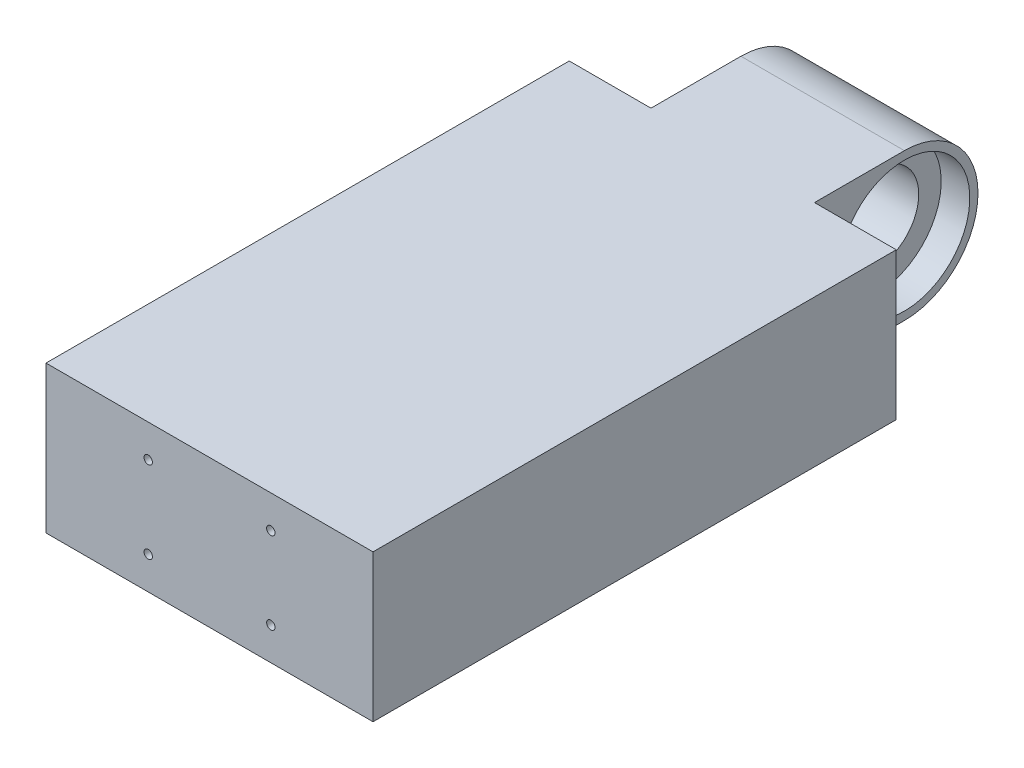
ISO-10303-21;
HEADER;
FILE_DESCRIPTION(('STEP AP214'),'2;1');
FILE_NAME('part.step','',(''),(''),'','','');
FILE_SCHEMA(('AUTOMOTIVE_DESIGN { 1 0 10303 214 1 1 1 1 }'));
ENDSEC;
DATA;
#1=APPLICATION_CONTEXT('core data for automotive mechanical design processes');
#2=APPLICATION_PROTOCOL_DEFINITION('international standard','automotive_design',2000,#1);
#3=PRODUCT_CONTEXT('',#1,'mechanical');
#4=PRODUCT('Part','Part','',(#3));
#5=PRODUCT_RELATED_PRODUCT_CATEGORY('part','',(#4));
#6=PRODUCT_DEFINITION_FORMATION('','',#4);
#7=PRODUCT_DEFINITION_CONTEXT('part definition',#1,'design');
#8=PRODUCT_DEFINITION('design','',#6,#7);
#9=PRODUCT_DEFINITION_SHAPE('','',#8);
#10=(LENGTH_UNIT() NAMED_UNIT(*) SI_UNIT(.MILLI.,.METRE.));
#11=(NAMED_UNIT(*) PLANE_ANGLE_UNIT() SI_UNIT($,.RADIAN.));
#12=(NAMED_UNIT(*) SI_UNIT($,.STERADIAN.) SOLID_ANGLE_UNIT());
#13=UNCERTAINTY_MEASURE_WITH_UNIT(LENGTH_MEASURE(1.E-05),#10,'distance_accuracy_value','');
#14=(GEOMETRIC_REPRESENTATION_CONTEXT(3) GLOBAL_UNCERTAINTY_ASSIGNED_CONTEXT((#13)) GLOBAL_UNIT_ASSIGNED_CONTEXT((#10,
#11,#12)) REPRESENTATION_CONTEXT('',''));
#15=CARTESIAN_POINT('',(0.,0.,0.));
#16=DIRECTION('',(0.,0.,1.));
#17=DIRECTION('',(1.,0.,0.));
#18=AXIS2_PLACEMENT_3D('',#15,#16,#17);
#19=CARTESIAN_POINT('',(80.,18.,0.));
#20=DIRECTION('',(-1.,0.,0.));
#21=DIRECTION('',(0.,0.,1.));
#22=AXIS2_PLACEMENT_3D('',#19,#20,#21);
#23=CYLINDRICAL_SURFACE('',#22,10.5);
#24=CARTESIAN_POINT('',(27.,18.,0.));
#25=DIRECTION('',(-1.,0.,0.));
#26=DIRECTION('',(0.,0.,1.));
#27=AXIS2_PLACEMENT_3D('',#24,#25,#26);
#28=CIRCLE('',#27,10.5);
#29=CARTESIAN_POINT('',(27.,18.,10.5));
#30=VERTEX_POINT('',#29);
#31=EDGE_CURVE('E159',#30,#30,#28,.F.);
#32=ORIENTED_EDGE('',*,*,#31,.F.);
#33=EDGE_LOOP('',(#32));
#34=FACE_BOUND('',#33,.T.);
#35=CARTESIAN_POINT('',(53.,18.,0.));
#36=DIRECTION('',(1.,0.,0.));
#37=DIRECTION('',(0.,0.,-1.));
#38=AXIS2_PLACEMENT_3D('',#35,#36,#37);
#39=CIRCLE('',#38,10.5);
#40=CARTESIAN_POINT('',(53.,18.,-10.5));
#41=VERTEX_POINT('',#40);
#42=EDGE_CURVE('E49',#41,#41,#39,.F.);
#43=ORIENTED_EDGE('',*,*,#42,.F.);
#44=EDGE_LOOP('',(#43));
#45=FACE_BOUND('',#44,.T.);
#46=ADVANCED_FACE('F45',(#34,#45),#23,.F.);
#47=CARTESIAN_POINT('',(0.,0.,150.));
#48=DIRECTION('',(1.,0.,0.));
#49=DIRECTION('',(0.,0.,-1.));
#50=AXIS2_PLACEMENT_3D('',#47,#48,#49);
#51=PLANE('',#50);
#52=DIRECTION('',(0.,0.,-1.));
#53=VECTOR('',#52,1.);
#54=CARTESIAN_POINT('',(0.,36.,150.));
#55=LINE('',#54,#53);
#56=CARTESIAN_POINT('',(0.,36.,150.));
#57=VERTEX_POINT('',#56);
#58=CARTESIAN_POINT('',(0.,36.,22.));
#59=VERTEX_POINT('',#58);
#60=EDGE_CURVE('E225',#57,#59,#55,.T.);
#61=ORIENTED_EDGE('',*,*,#60,.T.);
#62=DIRECTION('',(0.,1.,0.));
#63=VECTOR('',#62,1.);
#64=CARTESIAN_POINT('',(0.,-44.,22.));
#65=LINE('',#64,#63);
#66=CARTESIAN_POINT('',(0.,0.,22.));
#67=VERTEX_POINT('',#66);
#68=EDGE_CURVE('E162',#67,#59,#65,.T.);
#69=ORIENTED_EDGE('',*,*,#68,.F.);
#70=DIRECTION('',(0.,0.,-1.));
#71=VECTOR('',#70,1.);
#72=CARTESIAN_POINT('',(0.,0.,150.));
#73=LINE('',#72,#71);
#74=CARTESIAN_POINT('',(0.,0.,150.));
#75=VERTEX_POINT('',#74);
#76=EDGE_CURVE('E240',#75,#67,#73,.T.);
#77=ORIENTED_EDGE('',*,*,#76,.F.);
#78=DIRECTION('',(0.,-1.,0.));
#79=VECTOR('',#78,1.);
#80=CARTESIAN_POINT('',(0.,0.,150.));
#81=LINE('',#80,#79);
#82=EDGE_CURVE('E211',#57,#75,#81,.T.);
#83=ORIENTED_EDGE('',*,*,#82,.F.);
#84=EDGE_LOOP('',(#61,#69,#77,#83));
#85=FACE_BOUND('',#84,.T.);
#86=ADVANCED_FACE('F47',(#85),#51,.F.);
#87=CARTESIAN_POINT('',(0.,0.,150.));
#88=DIRECTION('',(0.,1.,0.));
#89=DIRECTION('',(0.,0.,1.));
#90=AXIS2_PLACEMENT_3D('',#87,#88,#89);
#91=PLANE('',#90);
#92=DIRECTION('',(0.,0.,1.));
#93=VECTOR('',#92,1.);
#94=CARTESIAN_POINT('',(60.,0.,150.));
#95=LINE('',#94,#93);
#96=CARTESIAN_POINT('',(60.,0.,0.));
#97=VERTEX_POINT('',#96);
#98=CARTESIAN_POINT('',(60.,0.,22.));
#99=VERTEX_POINT('',#98);
#100=EDGE_CURVE('E62',#97,#99,#95,.T.);
#101=ORIENTED_EDGE('',*,*,#100,.T.);
#102=DIRECTION('',(1.,0.,0.));
#103=VECTOR('',#102,1.);
#104=CARTESIAN_POINT('',(0.,0.,22.));
#105=LINE('',#104,#103);
#106=CARTESIAN_POINT('',(80.,0.,22.));
#107=VERTEX_POINT('',#106);
#108=EDGE_CURVE('E130',#99,#107,#105,.T.);
#109=ORIENTED_EDGE('',*,*,#108,.T.);
#110=DIRECTION('',(0.,0.,-1.));
#111=VECTOR('',#110,1.);
#112=CARTESIAN_POINT('',(80.,0.,150.));
#113=LINE('',#112,#111);
#114=CARTESIAN_POINT('',(80.,0.,150.));
#115=VERTEX_POINT('',#114);
#116=EDGE_CURVE('E236',#115,#107,#113,.T.);
#117=ORIENTED_EDGE('',*,*,#116,.F.);
#118=DIRECTION('',(1.,0.,0.));
#119=VECTOR('',#118,1.);
#120=CARTESIAN_POINT('',(0.,0.,150.));
#121=LINE('',#120,#119);
#122=EDGE_CURVE('E215',#75,#115,#121,.T.);
#123=ORIENTED_EDGE('',*,*,#122,.F.);
#124=ORIENTED_EDGE('',*,*,#76,.T.);
#125=DIRECTION('',(1.,0.,0.));
#126=VECTOR('',#125,1.);
#127=CARTESIAN_POINT('',(0.,0.,22.));
#128=LINE('',#127,#126);
#129=CARTESIAN_POINT('',(20.,0.,22.));
#130=VERTEX_POINT('',#129);
#131=EDGE_CURVE('E172',#67,#130,#128,.T.);
#132=ORIENTED_EDGE('',*,*,#131,.T.);
#133=DIRECTION('',(0.,0.,-1.));
#134=VECTOR('',#133,1.);
#135=CARTESIAN_POINT('',(20.,0.,150.));
#136=LINE('',#135,#134);
#137=CARTESIAN_POINT('',(20.,0.,0.));
#138=VERTEX_POINT('',#137);
#139=EDGE_CURVE('E153',#130,#138,#136,.T.);
#140=ORIENTED_EDGE('',*,*,#139,.T.);
#141=DIRECTION('',(1.,0.,0.));
#142=VECTOR('',#141,1.);
#143=CARTESIAN_POINT('',(0.,0.,0.));
#144=LINE('',#143,#142);
#145=EDGE_CURVE('E210',#138,#97,#144,.T.);
#146=ORIENTED_EDGE('',*,*,#145,.T.);
#147=EDGE_LOOP('',(#101,#109,#117,#123,#124,#132,#140,#146));
#148=FACE_BOUND('',#147,.T.);
#149=ADVANCED_FACE('F281',(#148),#91,.F.);
#150=CARTESIAN_POINT('',(80.,0.,150.));
#151=DIRECTION('',(-1.,0.,0.));
#152=DIRECTION('',(0.,0.,1.));
#153=AXIS2_PLACEMENT_3D('',#150,#151,#152);
#154=PLANE('',#153);
#155=ORIENTED_EDGE('',*,*,#116,.T.);
#156=DIRECTION('',(0.,1.,0.));
#157=VECTOR('',#156,1.);
#158=CARTESIAN_POINT('',(80.,-44.,22.));
#159=LINE('',#158,#157);
#160=CARTESIAN_POINT('',(80.,36.,22.));
#161=VERTEX_POINT('',#160);
#162=EDGE_CURVE('E132',#107,#161,#159,.T.);
#163=ORIENTED_EDGE('',*,*,#162,.T.);
#164=DIRECTION('',(0.,0.,-1.));
#165=VECTOR('',#164,1.);
#166=CARTESIAN_POINT('',(80.,36.,150.));
#167=LINE('',#166,#165);
#168=CARTESIAN_POINT('',(80.,36.,150.));
#169=VERTEX_POINT('',#168);
#170=EDGE_CURVE('E147',#169,#161,#167,.T.);
#171=ORIENTED_EDGE('',*,*,#170,.F.);
#172=DIRECTION('',(0.,1.,0.));
#173=VECTOR('',#172,1.);
#174=CARTESIAN_POINT('',(80.,0.,150.));
#175=LINE('',#174,#173);
#176=EDGE_CURVE('E219',#115,#169,#175,.T.);
#177=ORIENTED_EDGE('',*,*,#176,.F.);
#178=EDGE_LOOP('',(#155,#163,#171,#177));
#179=FACE_BOUND('',#178,.T.);
#180=ADVANCED_FACE('F343',(#179),#154,.F.);
#181=CARTESIAN_POINT('',(0.,36.,150.));
#182=DIRECTION('',(0.,-1.,0.));
#183=DIRECTION('',(0.,0.,-1.));
#184=AXIS2_PLACEMENT_3D('',#181,#182,#183);
#185=PLANE('',#184);
#186=ORIENTED_EDGE('',*,*,#170,.T.);
#187=DIRECTION('',(1.,0.,0.));
#188=VECTOR('',#187,1.);
#189=CARTESIAN_POINT('',(80.,36.,22.));
#190=LINE('',#189,#188);
#191=CARTESIAN_POINT('',(60.,36.,22.));
#192=VERTEX_POINT('',#191);
#193=EDGE_CURVE('E127',#192,#161,#190,.T.);
#194=ORIENTED_EDGE('',*,*,#193,.F.);
#195=DIRECTION('',(0.,0.,1.));
#196=VECTOR('',#195,1.);
#197=CARTESIAN_POINT('',(60.,36.,-18.));
#198=LINE('',#197,#196);
#199=CARTESIAN_POINT('',(60.,36.,0.));
#200=VERTEX_POINT('',#199);
#201=EDGE_CURVE('E135',#200,#192,#198,.T.);
#202=ORIENTED_EDGE('',*,*,#201,.F.);
#203=DIRECTION('',(-1.,0.,0.));
#204=VECTOR('',#203,1.);
#205=CARTESIAN_POINT('',(0.,36.,0.));
#206=LINE('',#205,#204);
#207=CARTESIAN_POINT('',(20.,36.,0.));
#208=VERTEX_POINT('',#207);
#209=EDGE_CURVE('E216',#200,#208,#206,.T.);
#210=ORIENTED_EDGE('',*,*,#209,.T.);
#211=DIRECTION('',(0.,0.,-1.));
#212=VECTOR('',#211,1.);
#213=CARTESIAN_POINT('',(20.,36.,-18.));
#214=LINE('',#213,#212);
#215=CARTESIAN_POINT('',(20.,36.,22.));
#216=VERTEX_POINT('',#215);
#217=EDGE_CURVE('E70',#216,#208,#214,.T.);
#218=ORIENTED_EDGE('',*,*,#217,.F.);
#219=DIRECTION('',(1.,0.,0.));
#220=VECTOR('',#219,1.);
#221=CARTESIAN_POINT('',(0.,36.,22.));
#222=LINE('',#221,#220);
#223=EDGE_CURVE('E155',#59,#216,#222,.T.);
#224=ORIENTED_EDGE('',*,*,#223,.F.);
#225=ORIENTED_EDGE('',*,*,#60,.F.);
#226=DIRECTION('',(-1.,0.,0.));
#227=VECTOR('',#226,1.);
#228=CARTESIAN_POINT('',(0.,36.,150.));
#229=LINE('',#228,#227);
#230=EDGE_CURVE('E222',#169,#57,#229,.T.);
#231=ORIENTED_EDGE('',*,*,#230,.F.);
#232=EDGE_LOOP('',(#186,#194,#202,#210,#218,#224,#225,#231));
#233=FACE_BOUND('',#232,.T.);
#234=ADVANCED_FACE('F144',(#233),#185,.F.);
#235=CARTESIAN_POINT('',(0.,0.,150.));
#236=DIRECTION('',(0.,0.,-1.));
#237=DIRECTION('',(-1.,0.,0.));
#238=AXIS2_PLACEMENT_3D('',#235,#236,#237);
#239=PLANE('',#238);
#240=CARTESIAN_POINT('',(25.,28.,150.));
#241=DIRECTION('',(0.,0.,1.));
#242=DIRECTION('',(1.,0.,0.));
#243=AXIS2_PLACEMENT_3D('',#240,#241,#242);
#244=CIRCLE('',#243,1.02499999999999);
#245=CARTESIAN_POINT('',(26.025,28.,150.));
#246=VERTEX_POINT('',#245);
#247=EDGE_CURVE('E178',#246,#246,#244,.T.);
#248=ORIENTED_EDGE('',*,*,#247,.F.);
#249=EDGE_LOOP('',(#248));
#250=FACE_BOUND('',#249,.T.);
#251=CARTESIAN_POINT('',(55.,28.,150.));
#252=DIRECTION('',(0.,0.,1.));
#253=DIRECTION('',(1.,0.,0.));
#254=AXIS2_PLACEMENT_3D('',#251,#252,#253);
#255=CIRCLE('',#254,1.02499999999999);
#256=CARTESIAN_POINT('',(56.025,28.,150.));
#257=VERTEX_POINT('',#256);
#258=EDGE_CURVE('E186',#257,#257,#255,.T.);
#259=ORIENTED_EDGE('',*,*,#258,.F.);
#260=EDGE_LOOP('',(#259));
#261=FACE_BOUND('',#260,.T.);
#262=CARTESIAN_POINT('',(55.,8.,150.));
#263=DIRECTION('',(0.,0.,1.));
#264=DIRECTION('',(1.,0.,0.));
#265=AXIS2_PLACEMENT_3D('',#262,#263,#264);
#266=CIRCLE('',#265,1.02499999999999);
#267=CARTESIAN_POINT('',(56.025,8.,150.));
#268=VERTEX_POINT('',#267);
#269=EDGE_CURVE('E194',#268,#268,#266,.T.);
#270=ORIENTED_EDGE('',*,*,#269,.F.);
#271=EDGE_LOOP('',(#270));
#272=FACE_BOUND('',#271,.T.);
#273=CARTESIAN_POINT('',(25.,7.99999999999999,150.));
#274=DIRECTION('',(0.,0.,1.));
#275=DIRECTION('',(1.,0.,0.));
#276=AXIS2_PLACEMENT_3D('',#273,#274,#275);
#277=CIRCLE('',#276,1.02499999999999);
#278=CARTESIAN_POINT('',(26.025,7.99999999999999,150.));
#279=VERTEX_POINT('',#278);
#280=EDGE_CURVE('E202',#279,#279,#277,.T.);
#281=ORIENTED_EDGE('',*,*,#280,.F.);
#282=EDGE_LOOP('',(#281));
#283=FACE_BOUND('',#282,.T.);
#284=ORIENTED_EDGE('',*,*,#82,.T.);
#285=ORIENTED_EDGE('',*,*,#122,.T.);
#286=ORIENTED_EDGE('',*,*,#176,.T.);
#287=ORIENTED_EDGE('',*,*,#230,.T.);
#288=EDGE_LOOP('',(#284,#285,#286,#287));
#289=FACE_BOUND('',#288,.T.);
#290=ADVANCED_FACE('F336',(#250,#261,#272,#283,#289),#239,.F.);
#291=CARTESIAN_POINT('',(25.,7.99999999999999,146.65));
#292=DIRECTION('',(0.,0.,1.));
#293=DIRECTION('',(1.,0.,0.));
#294=AXIS2_PLACEMENT_3D('',#291,#292,#293);
#295=CONICAL_SURFACE('',#294,1.02499999999999,1.02974425867665);
#296=CARTESIAN_POINT('',(25.,7.99999999999999,146.034117865497));
#297=VERTEX_POINT('',#296);
#298=VERTEX_LOOP('',#297);
#299=FACE_BOUND('',#298,.T.);
#300=CARTESIAN_POINT('',(25.,7.99999999999999,146.65));
#301=DIRECTION('',(0.,0.,1.));
#302=DIRECTION('',(1.,0.,0.));
#303=AXIS2_PLACEMENT_3D('',#300,#301,#302);
#304=CIRCLE('',#303,1.02499999999999);
#305=CARTESIAN_POINT('',(26.025,7.99999999999999,146.65));
#306=VERTEX_POINT('',#305);
#307=EDGE_CURVE('E206',#306,#306,#304,.T.);
#308=ORIENTED_EDGE('',*,*,#307,.T.);
#309=EDGE_LOOP('',(#308));
#310=FACE_BOUND('',#309,.T.);
#311=ADVANCED_FACE('F332',(#299,#310),#295,.F.);
#312=CARTESIAN_POINT('',(25.,7.99999999999999,150.));
#313=DIRECTION('',(0.,0.,1.));
#314=DIRECTION('',(1.,0.,0.));
#315=AXIS2_PLACEMENT_3D('',#312,#313,#314);
#316=CYLINDRICAL_SURFACE('',#315,1.02499999999999);
#317=ORIENTED_EDGE('',*,*,#307,.F.);
#318=EDGE_LOOP('',(#317));
#319=FACE_BOUND('',#318,.T.);
#320=ORIENTED_EDGE('',*,*,#280,.T.);
#321=EDGE_LOOP('',(#320));
#322=FACE_BOUND('',#321,.T.);
#323=ADVANCED_FACE('F328',(#319,#322),#316,.F.);
#324=CARTESIAN_POINT('',(55.,8.,146.65));
#325=DIRECTION('',(0.,0.,1.));
#326=DIRECTION('',(1.,0.,0.));
#327=AXIS2_PLACEMENT_3D('',#324,#325,#326);
#328=CONICAL_SURFACE('',#327,1.02499999999999,1.02974425867665);
#329=CARTESIAN_POINT('',(55.,8.,146.034117865497));
#330=VERTEX_POINT('',#329);
#331=VERTEX_LOOP('',#330);
#332=FACE_BOUND('',#331,.T.);
#333=CARTESIAN_POINT('',(55.,8.,146.65));
#334=DIRECTION('',(0.,0.,1.));
#335=DIRECTION('',(1.,0.,0.));
#336=AXIS2_PLACEMENT_3D('',#333,#334,#335);
#337=CIRCLE('',#336,1.02499999999999);
#338=CARTESIAN_POINT('',(56.025,8.,146.65));
#339=VERTEX_POINT('',#338);
#340=EDGE_CURVE('E198',#339,#339,#337,.T.);
#341=ORIENTED_EDGE('',*,*,#340,.T.);
#342=EDGE_LOOP('',(#341));
#343=FACE_BOUND('',#342,.T.);
#344=ADVANCED_FACE('F324',(#332,#343),#328,.F.);
#345=CARTESIAN_POINT('',(55.,8.,150.));
#346=DIRECTION('',(0.,0.,1.));
#347=DIRECTION('',(1.,0.,0.));
#348=AXIS2_PLACEMENT_3D('',#345,#346,#347);
#349=CYLINDRICAL_SURFACE('',#348,1.02499999999999);
#350=ORIENTED_EDGE('',*,*,#340,.F.);
#351=EDGE_LOOP('',(#350));
#352=FACE_BOUND('',#351,.T.);
#353=ORIENTED_EDGE('',*,*,#269,.T.);
#354=EDGE_LOOP('',(#353));
#355=FACE_BOUND('',#354,.T.);
#356=ADVANCED_FACE('F320',(#352,#355),#349,.F.);
#357=CARTESIAN_POINT('',(55.,28.,146.65));
#358=DIRECTION('',(0.,0.,1.));
#359=DIRECTION('',(1.,0.,0.));
#360=AXIS2_PLACEMENT_3D('',#357,#358,#359);
#361=CONICAL_SURFACE('',#360,1.02499999999999,1.02974425867665);
#362=CARTESIAN_POINT('',(55.,28.,146.034117865497));
#363=VERTEX_POINT('',#362);
#364=VERTEX_LOOP('',#363);
#365=FACE_BOUND('',#364,.T.);
#366=CARTESIAN_POINT('',(55.,28.,146.65));
#367=DIRECTION('',(0.,0.,1.));
#368=DIRECTION('',(1.,0.,0.));
#369=AXIS2_PLACEMENT_3D('',#366,#367,#368);
#370=CIRCLE('',#369,1.02499999999999);
#371=CARTESIAN_POINT('',(56.025,28.,146.65));
#372=VERTEX_POINT('',#371);
#373=EDGE_CURVE('E190',#372,#372,#370,.T.);
#374=ORIENTED_EDGE('',*,*,#373,.T.);
#375=EDGE_LOOP('',(#374));
#376=FACE_BOUND('',#375,.T.);
#377=ADVANCED_FACE('F316',(#365,#376),#361,.F.);
#378=CARTESIAN_POINT('',(55.,28.,150.));
#379=DIRECTION('',(0.,0.,1.));
#380=DIRECTION('',(1.,0.,0.));
#381=AXIS2_PLACEMENT_3D('',#378,#379,#380);
#382=CYLINDRICAL_SURFACE('',#381,1.02499999999999);
#383=ORIENTED_EDGE('',*,*,#373,.F.);
#384=EDGE_LOOP('',(#383));
#385=FACE_BOUND('',#384,.T.);
#386=ORIENTED_EDGE('',*,*,#258,.T.);
#387=EDGE_LOOP('',(#386));
#388=FACE_BOUND('',#387,.T.);
#389=ADVANCED_FACE('F312',(#385,#388),#382,.F.);
#390=CARTESIAN_POINT('',(25.,28.,146.65));
#391=DIRECTION('',(0.,0.,1.));
#392=DIRECTION('',(1.,0.,0.));
#393=AXIS2_PLACEMENT_3D('',#390,#391,#392);
#394=CONICAL_SURFACE('',#393,1.02499999999999,1.02974425867665);
#395=CARTESIAN_POINT('',(25.,28.,146.034117865497));
#396=VERTEX_POINT('',#395);
#397=VERTEX_LOOP('',#396);
#398=FACE_BOUND('',#397,.T.);
#399=CARTESIAN_POINT('',(25.,28.,146.65));
#400=DIRECTION('',(0.,0.,1.));
#401=DIRECTION('',(1.,0.,0.));
#402=AXIS2_PLACEMENT_3D('',#399,#400,#401);
#403=CIRCLE('',#402,1.02499999999999);
#404=CARTESIAN_POINT('',(26.025,28.,146.65));
#405=VERTEX_POINT('',#404);
#406=EDGE_CURVE('E182',#405,#405,#403,.T.);
#407=ORIENTED_EDGE('',*,*,#406,.T.);
#408=EDGE_LOOP('',(#407));
#409=FACE_BOUND('',#408,.T.);
#410=ADVANCED_FACE('F308',(#398,#409),#394,.F.);
#411=CARTESIAN_POINT('',(25.,28.,150.));
#412=DIRECTION('',(0.,0.,1.));
#413=DIRECTION('',(1.,0.,0.));
#414=AXIS2_PLACEMENT_3D('',#411,#412,#413);
#415=CYLINDRICAL_SURFACE('',#414,1.02499999999999);
#416=ORIENTED_EDGE('',*,*,#406,.F.);
#417=EDGE_LOOP('',(#416));
#418=FACE_BOUND('',#417,.T.);
#419=ORIENTED_EDGE('',*,*,#247,.T.);
#420=EDGE_LOOP('',(#419));
#421=FACE_BOUND('',#420,.T.);
#422=ADVANCED_FACE('F304',(#418,#421),#415,.F.);
#423=CARTESIAN_POINT('',(80.,18.,0.));
#424=DIRECTION('',(-1.,0.,0.));
#425=DIRECTION('',(0.,0.,1.));
#426=AXIS2_PLACEMENT_3D('',#423,#424,#425);
#427=CYLINDRICAL_SURFACE('',#426,18.);
#428=ORIENTED_EDGE('',*,*,#209,.F.);
#429=CARTESIAN_POINT('',(60.,18.,0.));
#430=DIRECTION('',(-1.,0.,0.));
#431=DIRECTION('',(0.,0.,1.));
#432=AXIS2_PLACEMENT_3D('',#429,#430,#431);
#433=CIRCLE('',#432,18.);
#434=EDGE_CURVE('E11',#97,#200,#433,.F.);
#435=ORIENTED_EDGE('',*,*,#434,.F.);
#436=ORIENTED_EDGE('',*,*,#145,.F.);
#437=CARTESIAN_POINT('',(20.,18.,0.));
#438=DIRECTION('',(1.,0.,0.));
#439=DIRECTION('',(0.,0.,-1.));
#440=AXIS2_PLACEMENT_3D('',#437,#438,#439);
#441=CIRCLE('',#440,18.);
#442=EDGE_CURVE('E55',#208,#138,#441,.F.);
#443=ORIENTED_EDGE('',*,*,#442,.F.);
#444=EDGE_LOOP('',(#428,#435,#436,#443));
#445=FACE_BOUND('',#444,.T.);
#446=ADVANCED_FACE('F300',(#445),#427,.T.);
#447=CARTESIAN_POINT('',(0.,-44.,22.));
#448=DIRECTION('',(0.,0.,1.));
#449=DIRECTION('',(1.,0.,0.));
#450=AXIS2_PLACEMENT_3D('',#447,#448,#449);
#451=PLANE('',#450);
#452=ORIENTED_EDGE('',*,*,#68,.T.);
#453=ORIENTED_EDGE('',*,*,#223,.T.);
#454=DIRECTION('',(0.,1.,0.));
#455=VECTOR('',#454,1.);
#456=CARTESIAN_POINT('',(20.,-44.,22.));
#457=LINE('',#456,#455);
#458=EDGE_CURVE('E141',#130,#216,#457,.T.);
#459=ORIENTED_EDGE('',*,*,#458,.F.);
#460=ORIENTED_EDGE('',*,*,#131,.F.);
#461=EDGE_LOOP('',(#452,#453,#459,#460));
#462=FACE_BOUND('',#461,.T.);
#463=ADVANCED_FACE('F296',(#462),#451,.F.);
#464=CARTESIAN_POINT('',(20.,-44.,-18.));
#465=DIRECTION('',(1.,0.,0.));
#466=DIRECTION('',(0.,0.,-1.));
#467=AXIS2_PLACEMENT_3D('',#464,#465,#466);
#468=PLANE('',#467);
#469=CARTESIAN_POINT('',(20.,18.,0.));
#470=DIRECTION('',(-1.,0.,0.));
#471=DIRECTION('',(0.,0.,1.));
#472=AXIS2_PLACEMENT_3D('',#469,#470,#471);
#473=CIRCLE('',#472,16.);
#474=CARTESIAN_POINT('',(20.,18.,16.));
#475=VERTEX_POINT('',#474);
#476=EDGE_CURVE('E252',#475,#475,#473,.T.);
#477=ORIENTED_EDGE('',*,*,#476,.F.);
#478=EDGE_LOOP('',(#477));
#479=FACE_BOUND('',#478,.T.);
#480=ORIENTED_EDGE('',*,*,#458,.T.);
#481=ORIENTED_EDGE('',*,*,#217,.T.);
#482=ORIENTED_EDGE('',*,*,#442,.T.);
#483=ORIENTED_EDGE('',*,*,#139,.F.);
#484=EDGE_LOOP('',(#480,#481,#482,#483));
#485=FACE_BOUND('',#484,.T.);
#486=ADVANCED_FACE('F289',(#479,#485),#468,.F.);
#487=CARTESIAN_POINT('',(80.,-44.,22.));
#488=DIRECTION('',(0.,0.,1.));
#489=DIRECTION('',(1.,0.,0.));
#490=AXIS2_PLACEMENT_3D('',#487,#488,#489);
#491=PLANE('',#490);
#492=DIRECTION('',(0.,1.,0.));
#493=VECTOR('',#492,1.);
#494=CARTESIAN_POINT('',(60.,-44.,22.));
#495=LINE('',#494,#493);
#496=EDGE_CURVE('E123',#99,#192,#495,.T.);
#497=ORIENTED_EDGE('',*,*,#496,.T.);
#498=ORIENTED_EDGE('',*,*,#193,.T.);
#499=ORIENTED_EDGE('',*,*,#162,.F.);
#500=ORIENTED_EDGE('',*,*,#108,.F.);
#501=EDGE_LOOP('',(#497,#498,#499,#500));
#502=FACE_BOUND('',#501,.T.);
#503=ADVANCED_FACE('F125',(#502),#491,.F.);
#504=CARTESIAN_POINT('',(60.,-44.,-18.));
#505=DIRECTION('',(-1.,0.,0.));
#506=DIRECTION('',(0.,0.,1.));
#507=AXIS2_PLACEMENT_3D('',#504,#505,#506);
#508=PLANE('',#507);
#509=CARTESIAN_POINT('',(60.,18.,0.));
#510=DIRECTION('',(-1.,0.,0.));
#511=DIRECTION('',(0.,0.,1.));
#512=AXIS2_PLACEMENT_3D('',#509,#510,#511);
#513=CIRCLE('',#512,16.);
#514=CARTESIAN_POINT('',(60.,18.,16.));
#515=VERTEX_POINT('',#514);
#516=EDGE_CURVE('E259',#515,#515,#513,.T.);
#517=ORIENTED_EDGE('',*,*,#516,.T.);
#518=EDGE_LOOP('',(#517));
#519=FACE_BOUND('',#518,.T.);
#520=ORIENTED_EDGE('',*,*,#434,.T.);
#521=ORIENTED_EDGE('',*,*,#201,.T.);
#522=ORIENTED_EDGE('',*,*,#496,.F.);
#523=ORIENTED_EDGE('',*,*,#100,.F.);
#524=EDGE_LOOP('',(#520,#521,#522,#523));
#525=FACE_BOUND('',#524,.T.);
#526=ADVANCED_FACE('F136',(#519,#525),#508,.F.);
#527=CARTESIAN_POINT('',(27.,18.,0.));
#528=DIRECTION('',(-1.,0.,0.));
#529=DIRECTION('',(0.,0.,1.));
#530=AXIS2_PLACEMENT_3D('',#527,#528,#529);
#531=PLANE('',#530);
#532=CARTESIAN_POINT('',(27.,18.,0.));
#533=DIRECTION('',(-1.,0.,0.));
#534=DIRECTION('',(0.,0.,1.));
#535=AXIS2_PLACEMENT_3D('',#532,#533,#534);
#536=CIRCLE('',#535,16.);
#537=CARTESIAN_POINT('',(27.,18.,16.));
#538=VERTEX_POINT('',#537);
#539=EDGE_CURVE('E247',#538,#538,#536,.T.);
#540=ORIENTED_EDGE('',*,*,#539,.T.);
#541=EDGE_LOOP('',(#540));
#542=FACE_BOUND('',#541,.T.);
#543=ORIENTED_EDGE('',*,*,#31,.T.);
#544=EDGE_LOOP('',(#543));
#545=FACE_BOUND('',#544,.T.);
#546=ADVANCED_FACE('F292',(#542,#545),#531,.T.);
#547=CARTESIAN_POINT('',(27.,18.,0.));
#548=DIRECTION('',(-1.,0.,0.));
#549=DIRECTION('',(0.,0.,1.));
#550=AXIS2_PLACEMENT_3D('',#547,#548,#549);
#551=CYLINDRICAL_SURFACE('',#550,16.);
#552=ORIENTED_EDGE('',*,*,#539,.F.);
#553=EDGE_LOOP('',(#552));
#554=FACE_BOUND('',#553,.T.);
#555=ORIENTED_EDGE('',*,*,#476,.T.);
#556=EDGE_LOOP('',(#555));
#557=FACE_BOUND('',#556,.T.);
#558=ADVANCED_FACE('F285',(#554,#557),#551,.F.);
#559=CARTESIAN_POINT('',(53.,18.,0.));
#560=DIRECTION('',(1.,0.,0.));
#561=DIRECTION('',(0.,0.,1.));
#562=AXIS2_PLACEMENT_3D('',#559,#560,#561);
#563=PLANE('',#562);
#564=CARTESIAN_POINT('',(53.,18.,0.));
#565=DIRECTION('',(-1.,0.,0.));
#566=DIRECTION('',(0.,0.,1.));
#567=AXIS2_PLACEMENT_3D('',#564,#565,#566);
#568=CIRCLE('',#567,16.);
#569=CARTESIAN_POINT('',(53.,18.,16.));
#570=VERTEX_POINT('',#569);
#571=EDGE_CURVE('E263',#570,#570,#568,.T.);
#572=ORIENTED_EDGE('',*,*,#571,.F.);
#573=EDGE_LOOP('',(#572));
#574=FACE_BOUND('',#573,.T.);
#575=ORIENTED_EDGE('',*,*,#42,.T.);
#576=EDGE_LOOP('',(#575));
#577=FACE_BOUND('',#576,.T.);
#578=ADVANCED_FACE('F272',(#574,#577),#563,.T.);
#579=CARTESIAN_POINT('',(53.,18.,0.));
#580=DIRECTION('',(1.,0.,0.));
#581=DIRECTION('',(0.,0.,-1.));
#582=AXIS2_PLACEMENT_3D('',#579,#580,#581);
#583=CYLINDRICAL_SURFACE('',#582,16.);
#584=ORIENTED_EDGE('',*,*,#571,.T.);
#585=EDGE_LOOP('',(#584));
#586=FACE_BOUND('',#585,.T.);
#587=ORIENTED_EDGE('',*,*,#516,.F.);
#588=EDGE_LOOP('',(#587));
#589=FACE_BOUND('',#588,.T.);
#590=ADVANCED_FACE('F431',(#586,#589),#583,.F.);
#591=CLOSED_SHELL('',(#46,#86,#149,#180,#234,#290,#311,#323,#344,#356,#377,#389,#410,#422,#446,
#463,#486,#503,#526,#546,#558,#578,#590));
#592=MANIFOLD_SOLID_BREP('B2',#591);
#593=ADVANCED_BREP_SHAPE_REPRESENTATION('',(#18,#592),#14);
#594=SHAPE_DEFINITION_REPRESENTATION(#9,#593);
ENDSEC;
END-ISO-10303-21;
